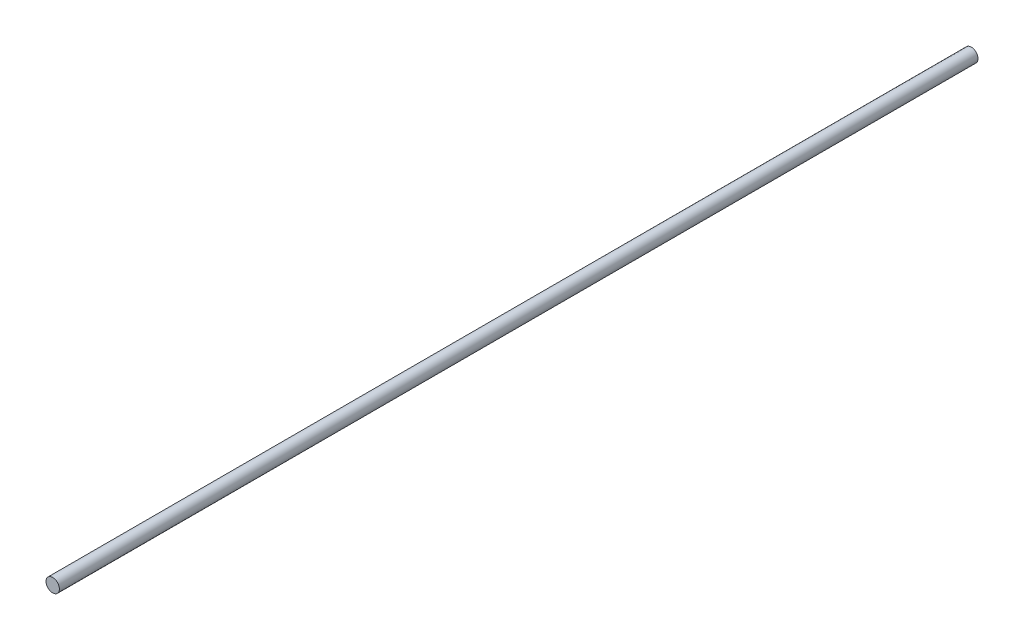
ISO-10303-21;
HEADER;
FILE_DESCRIPTION(('STEP AP214'),'2;1');
FILE_NAME('part.step','',(''),(''),'','','');
FILE_SCHEMA(('AUTOMOTIVE_DESIGN { 1 0 10303 214 1 1 1 1 }'));
ENDSEC;
DATA;
#1=APPLICATION_CONTEXT('core data for automotive mechanical design processes');
#2=APPLICATION_PROTOCOL_DEFINITION('international standard','automotive_design',2000,#1);
#3=PRODUCT_CONTEXT('',#1,'mechanical');
#4=PRODUCT('Part','Part','',(#3));
#5=PRODUCT_RELATED_PRODUCT_CATEGORY('part','',(#4));
#6=PRODUCT_DEFINITION_FORMATION('','',#4);
#7=PRODUCT_DEFINITION_CONTEXT('part definition',#1,'design');
#8=PRODUCT_DEFINITION('design','',#6,#7);
#9=PRODUCT_DEFINITION_SHAPE('','',#8);
#10=(LENGTH_UNIT() NAMED_UNIT(*) SI_UNIT(.MILLI.,.METRE.));
#11=(NAMED_UNIT(*) PLANE_ANGLE_UNIT() SI_UNIT($,.RADIAN.));
#12=(NAMED_UNIT(*) SI_UNIT($,.STERADIAN.) SOLID_ANGLE_UNIT());
#13=UNCERTAINTY_MEASURE_WITH_UNIT(LENGTH_MEASURE(1.E-05),#10,'distance_accuracy_value','');
#14=(GEOMETRIC_REPRESENTATION_CONTEXT(3) GLOBAL_UNCERTAINTY_ASSIGNED_CONTEXT((#13)) GLOBAL_UNIT_ASSIGNED_CONTEXT((#10,
#11,#12)) REPRESENTATION_CONTEXT('',''));
#15=CARTESIAN_POINT('',(0.,0.,0.));
#16=DIRECTION('',(0.,0.,1.));
#17=DIRECTION('',(1.,0.,0.));
#18=AXIS2_PLACEMENT_3D('',#15,#16,#17);
#19=CARTESIAN_POINT('',(0.,0.,1712.));
#20=DIRECTION('',(0.,0.,-1.));
#21=DIRECTION('',(-1.,0.,0.));
#22=AXIS2_PLACEMENT_3D('',#19,#20,#21);
#23=CYLINDRICAL_SURFACE('',#22,12.5);
#24=CARTESIAN_POINT('',(0.,0.,1712.));
#25=DIRECTION('',(0.,0.,1.));
#26=DIRECTION('',(1.,0.,0.));
#27=AXIS2_PLACEMENT_3D('',#24,#25,#26);
#28=CIRCLE('',#27,12.5);
#29=CARTESIAN_POINT('',(12.5,0.,1712.));
#30=VERTEX_POINT('',#29);
#31=EDGE_CURVE('E10',#30,#30,#28,.T.);
#32=ORIENTED_EDGE('',*,*,#31,.F.);
#33=EDGE_LOOP('',(#32));
#34=FACE_BOUND('',#33,.T.);
#35=CARTESIAN_POINT('',(0.,0.,0.));
#36=DIRECTION('',(0.,0.,1.));
#37=DIRECTION('',(1.,0.,0.));
#38=AXIS2_PLACEMENT_3D('',#35,#36,#37);
#39=CIRCLE('',#38,12.5);
#40=CARTESIAN_POINT('',(12.5,0.,0.));
#41=VERTEX_POINT('',#40);
#42=EDGE_CURVE('E44',#41,#41,#39,.T.);
#43=ORIENTED_EDGE('',*,*,#42,.T.);
#44=EDGE_LOOP('',(#43));
#45=FACE_BOUND('',#44,.T.);
#46=ADVANCED_FACE('F41',(#34,#45),#23,.T.);
#47=CARTESIAN_POINT('',(0.,0.,1712.));
#48=DIRECTION('',(0.,0.,1.));
#49=DIRECTION('',(1.,0.,0.));
#50=AXIS2_PLACEMENT_3D('',#47,#48,#49);
#51=PLANE('',#50);
#52=ORIENTED_EDGE('',*,*,#31,.T.);
#53=EDGE_LOOP('',(#52));
#54=FACE_BOUND('',#53,.T.);
#55=ADVANCED_FACE('F58',(#54),#51,.T.);
#56=CARTESIAN_POINT('',(0.,0.,0.));
#57=DIRECTION('',(0.,0.,1.));
#58=DIRECTION('',(1.,0.,0.));
#59=AXIS2_PLACEMENT_3D('',#56,#57,#58);
#60=PLANE('',#59);
#61=ORIENTED_EDGE('',*,*,#42,.F.);
#62=EDGE_LOOP('',(#61));
#63=FACE_BOUND('',#62,.T.);
#64=ADVANCED_FACE('F56',(#63),#60,.F.);
#65=CLOSED_SHELL('',(#46,#55,#64));
#66=MANIFOLD_SOLID_BREP('B2',#65);
#67=ADVANCED_BREP_SHAPE_REPRESENTATION('',(#18,#66),#14);
#68=SHAPE_DEFINITION_REPRESENTATION(#9,#67);
ENDSEC;
END-ISO-10303-21;
